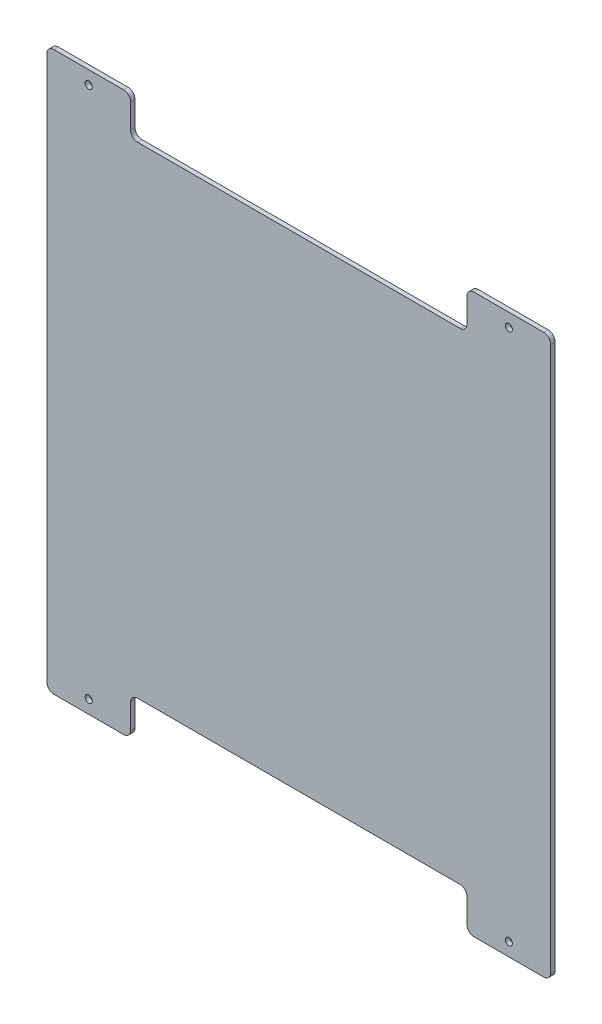
ISO-10303-21;
HEADER;
FILE_DESCRIPTION(('STEP AP214'),'2;1');
FILE_NAME('part.step','',(''),(''),'','','');
FILE_SCHEMA(('AUTOMOTIVE_DESIGN { 1 0 10303 214 1 1 1 1 }'));
ENDSEC;
DATA;
#1=APPLICATION_CONTEXT('core data for automotive mechanical design processes');
#2=APPLICATION_PROTOCOL_DEFINITION('international standard','automotive_design',2000,#1);
#3=PRODUCT_CONTEXT('',#1,'mechanical');
#4=PRODUCT('Part','Part','',(#3));
#5=PRODUCT_RELATED_PRODUCT_CATEGORY('part','',(#4));
#6=PRODUCT_DEFINITION_FORMATION('','',#4);
#7=PRODUCT_DEFINITION_CONTEXT('part definition',#1,'design');
#8=PRODUCT_DEFINITION('design','',#6,#7);
#9=PRODUCT_DEFINITION_SHAPE('','',#8);
#10=(LENGTH_UNIT() NAMED_UNIT(*) SI_UNIT(.MILLI.,.METRE.));
#11=(NAMED_UNIT(*) PLANE_ANGLE_UNIT() SI_UNIT($,.RADIAN.));
#12=(NAMED_UNIT(*) SI_UNIT($,.STERADIAN.) SOLID_ANGLE_UNIT());
#13=UNCERTAINTY_MEASURE_WITH_UNIT(LENGTH_MEASURE(1.E-05),#10,'distance_accuracy_value','');
#14=(GEOMETRIC_REPRESENTATION_CONTEXT(3) GLOBAL_UNCERTAINTY_ASSIGNED_CONTEXT((#13)) GLOBAL_UNIT_ASSIGNED_CONTEXT((#10,
#11,#12)) REPRESENTATION_CONTEXT('',''));
#15=CARTESIAN_POINT('',(0.,0.,0.));
#16=DIRECTION('',(0.,0.,1.));
#17=DIRECTION('',(1.,0.,0.));
#18=AXIS2_PLACEMENT_3D('',#15,#16,#17);
#19=CARTESIAN_POINT('',(115.500000041591,-177.5,3.175));
#20=DIRECTION('',(0.,0.,-1.));
#21=DIRECTION('',(-1.,0.,0.));
#22=AXIS2_PLACEMENT_3D('',#19,#20,#21);
#23=CYLINDRICAL_SURFACE('',#22,5.00000000000037);
#24=CARTESIAN_POINT('',(115.500000041591,-177.5,0.));
#25=DIRECTION('',(0.,0.,1.));
#26=DIRECTION('',(1.,0.,0.));
#27=AXIS2_PLACEMENT_3D('',#24,#25,#26);
#28=CIRCLE('',#27,5.00000000000037);
#29=CARTESIAN_POINT('',(120.500000041592,-177.5,0.));
#30=VERTEX_POINT('',#29);
#31=CARTESIAN_POINT('',(115.500000041591,-172.5,0.));
#32=VERTEX_POINT('',#31);
#33=EDGE_CURVE('E226',#30,#32,#28,.T.);
#34=ORIENTED_EDGE('',*,*,#33,.F.);
#35=DIRECTION('',(0.,0.,-1.));
#36=VECTOR('',#35,1.);
#37=CARTESIAN_POINT('',(120.500000041592,-177.5,3.175));
#38=LINE('',#37,#36);
#39=CARTESIAN_POINT('',(120.500000041592,-177.5,3.175));
#40=VERTEX_POINT('',#39);
#41=EDGE_CURVE('E11',#40,#30,#38,.T.);
#42=ORIENTED_EDGE('',*,*,#41,.F.);
#43=CARTESIAN_POINT('',(115.500000041591,-177.5,3.175));
#44=DIRECTION('',(0.,0.,1.));
#45=DIRECTION('',(1.,0.,0.));
#46=AXIS2_PLACEMENT_3D('',#43,#44,#45);
#47=CIRCLE('',#46,5.00000000000037);
#48=CARTESIAN_POINT('',(115.500000041591,-172.5,3.175));
#49=VERTEX_POINT('',#48);
#50=EDGE_CURVE('E290',#40,#49,#47,.T.);
#51=ORIENTED_EDGE('',*,*,#50,.T.);
#52=DIRECTION('',(0.,0.,-1.));
#53=VECTOR('',#52,1.);
#54=CARTESIAN_POINT('',(115.500000041591,-172.5,3.175));
#55=LINE('',#54,#53);
#56=EDGE_CURVE('E135',#49,#32,#55,.T.);
#57=ORIENTED_EDGE('',*,*,#56,.T.);
#58=EDGE_LOOP('',(#34,#42,#51,#57));
#59=FACE_BOUND('',#58,.T.);
#60=ADVANCED_FACE('F37',(#59),#23,.F.);
#61=CARTESIAN_POINT('',(120.500000041592,0.,3.175));
#62=DIRECTION('',(1.,0.,0.));
#63=DIRECTION('',(0.,1.,0.));
#64=AXIS2_PLACEMENT_3D('',#61,#62,#63);
#65=PLANE('',#64);
#66=DIRECTION('',(0.,-1.,0.));
#67=VECTOR('',#66,1.);
#68=CARTESIAN_POINT('',(120.500000041592,0.,0.));
#69=LINE('',#68,#67);
#70=CARTESIAN_POINT('',(120.500000041592,-195.,0.));
#71=VERTEX_POINT('',#70);
#72=EDGE_CURVE('E229',#30,#71,#69,.T.);
#73=ORIENTED_EDGE('',*,*,#72,.T.);
#74=DIRECTION('',(0.,0.,-1.));
#75=VECTOR('',#74,1.);
#76=CARTESIAN_POINT('',(120.500000041592,-195.,3.175));
#77=LINE('',#76,#75);
#78=CARTESIAN_POINT('',(120.500000041592,-195.,3.175));
#79=VERTEX_POINT('',#78);
#80=EDGE_CURVE('E45',#79,#71,#77,.T.);
#81=ORIENTED_EDGE('',*,*,#80,.F.);
#82=DIRECTION('',(0.,-1.,0.));
#83=VECTOR('',#82,1.);
#84=CARTESIAN_POINT('',(120.500000041592,0.,3.175));
#85=LINE('',#84,#83);
#86=EDGE_CURVE('E357',#40,#79,#85,.T.);
#87=ORIENTED_EDGE('',*,*,#86,.F.);
#88=ORIENTED_EDGE('',*,*,#41,.T.);
#89=EDGE_LOOP('',(#73,#81,#87,#88));
#90=FACE_BOUND('',#89,.T.);
#91=ADVANCED_FACE('F462',(#90),#65,.F.);
#92=CARTESIAN_POINT('',(125.500000041592,-195.,3.175));
#93=DIRECTION('',(0.,0.,-1.));
#94=DIRECTION('',(-1.,0.,0.));
#95=AXIS2_PLACEMENT_3D('',#92,#93,#94);
#96=CYLINDRICAL_SURFACE('',#95,5.00000000000001);
#97=CARTESIAN_POINT('',(125.500000041592,-195.,0.));
#98=DIRECTION('',(0.,0.,1.));
#99=DIRECTION('',(1.,0.,0.));
#100=AXIS2_PLACEMENT_3D('',#97,#98,#99);
#101=CIRCLE('',#100,5.00000000000001);
#102=CARTESIAN_POINT('',(125.500000041592,-200.,0.));
#103=VERTEX_POINT('',#102);
#104=EDGE_CURVE('E232',#71,#103,#101,.T.);
#105=ORIENTED_EDGE('',*,*,#104,.T.);
#106=DIRECTION('',(0.,0.,-1.));
#107=VECTOR('',#106,1.);
#108=CARTESIAN_POINT('',(125.500000041592,-200.,3.175));
#109=LINE('',#108,#107);
#110=CARTESIAN_POINT('',(125.500000041592,-200.,3.175));
#111=VERTEX_POINT('',#110);
#112=EDGE_CURVE('E332',#111,#103,#109,.T.);
#113=ORIENTED_EDGE('',*,*,#112,.F.);
#114=CARTESIAN_POINT('',(125.500000041592,-195.,3.175));
#115=DIRECTION('',(0.,0.,1.));
#116=DIRECTION('',(1.,0.,0.));
#117=AXIS2_PLACEMENT_3D('',#114,#115,#116);
#118=CIRCLE('',#117,5.00000000000001);
#119=EDGE_CURVE('E340',#79,#111,#118,.T.);
#120=ORIENTED_EDGE('',*,*,#119,.F.);
#121=ORIENTED_EDGE('',*,*,#80,.T.);
#122=EDGE_LOOP('',(#105,#113,#120,#121));
#123=FACE_BOUND('',#122,.T.);
#124=ADVANCED_FACE('F338',(#123),#96,.T.);
#125=CARTESIAN_POINT('',(1.11022302462516E-13,-200.,3.175));
#126=DIRECTION('',(0.,-1.,0.));
#127=DIRECTION('',(1.,0.,0.));
#128=AXIS2_PLACEMENT_3D('',#125,#126,#127);
#129=PLANE('',#128);
#130=DIRECTION('',(-1.,0.,0.));
#131=VECTOR('',#130,1.);
#132=CARTESIAN_POINT('',(1.11022302462516E-13,-200.,0.));
#133=LINE('',#132,#131);
#134=CARTESIAN_POINT('',(175.500000041592,-200.,0.));
#135=VERTEX_POINT('',#134);
#136=EDGE_CURVE('E235',#135,#103,#133,.T.);
#137=ORIENTED_EDGE('',*,*,#136,.F.);
#138=DIRECTION('',(0.,0.,-1.));
#139=VECTOR('',#138,1.);
#140=CARTESIAN_POINT('',(175.500000041592,-200.,3.175));
#141=LINE('',#140,#139);
#142=CARTESIAN_POINT('',(175.500000041592,-200.,3.175));
#143=VERTEX_POINT('',#142);
#144=EDGE_CURVE('E330',#143,#135,#141,.T.);
#145=ORIENTED_EDGE('',*,*,#144,.F.);
#146=DIRECTION('',(-1.,0.,0.));
#147=VECTOR('',#146,1.);
#148=CARTESIAN_POINT('',(1.11022302462516E-13,-200.,3.175));
#149=LINE('',#148,#147);
#150=EDGE_CURVE('E352',#143,#111,#149,.T.);
#151=ORIENTED_EDGE('',*,*,#150,.T.);
#152=ORIENTED_EDGE('',*,*,#112,.T.);
#153=EDGE_LOOP('',(#137,#145,#151,#152));
#154=FACE_BOUND('',#153,.T.);
#155=ADVANCED_FACE('F348',(#154),#129,.T.);
#156=CARTESIAN_POINT('',(175.500000041592,-195.,3.175));
#157=DIRECTION('',(0.,0.,-1.));
#158=DIRECTION('',(-1.,0.,0.));
#159=AXIS2_PLACEMENT_3D('',#156,#157,#158);
#160=CYLINDRICAL_SURFACE('',#159,5.00000000000002);
#161=CARTESIAN_POINT('',(175.500000041592,-195.,0.));
#162=DIRECTION('',(0.,0.,1.));
#163=DIRECTION('',(1.,0.,0.));
#164=AXIS2_PLACEMENT_3D('',#161,#162,#163);
#165=CIRCLE('',#164,5.00000000000002);
#166=CARTESIAN_POINT('',(180.500000041592,-195.,0.));
#167=VERTEX_POINT('',#166);
#168=EDGE_CURVE('E238',#135,#167,#165,.T.);
#169=ORIENTED_EDGE('',*,*,#168,.T.);
#170=DIRECTION('',(0.,0.,-1.));
#171=VECTOR('',#170,1.);
#172=CARTESIAN_POINT('',(180.500000041592,-195.,3.175));
#173=LINE('',#172,#171);
#174=CARTESIAN_POINT('',(180.500000041592,-195.,3.175));
#175=VERTEX_POINT('',#174);
#176=EDGE_CURVE('E328',#175,#167,#173,.T.);
#177=ORIENTED_EDGE('',*,*,#176,.F.);
#178=CARTESIAN_POINT('',(175.500000041592,-195.,3.175));
#179=DIRECTION('',(0.,0.,1.));
#180=DIRECTION('',(1.,0.,0.));
#181=AXIS2_PLACEMENT_3D('',#178,#179,#180);
#182=CIRCLE('',#181,5.00000000000002);
#183=EDGE_CURVE('E353',#143,#175,#182,.T.);
#184=ORIENTED_EDGE('',*,*,#183,.F.);
#185=ORIENTED_EDGE('',*,*,#144,.T.);
#186=EDGE_LOOP('',(#169,#177,#184,#185));
#187=FACE_BOUND('',#186,.T.);
#188=ADVANCED_FACE('F473',(#187),#160,.T.);
#189=CARTESIAN_POINT('',(180.500000041592,0.,3.175));
#190=DIRECTION('',(1.,0.,0.));
#191=DIRECTION('',(0.,0.,-1.));
#192=AXIS2_PLACEMENT_3D('',#189,#190,#191);
#193=PLANE('',#192);
#194=DIRECTION('',(0.,-1.,0.));
#195=VECTOR('',#194,1.);
#196=CARTESIAN_POINT('',(180.500000041592,0.,0.));
#197=LINE('',#196,#195);
#198=CARTESIAN_POINT('',(180.500000041592,195.,0.));
#199=VERTEX_POINT('',#198);
#200=EDGE_CURVE('E241',#199,#167,#197,.T.);
#201=ORIENTED_EDGE('',*,*,#200,.F.);
#202=DIRECTION('',(0.,0.,-1.));
#203=VECTOR('',#202,1.);
#204=CARTESIAN_POINT('',(180.500000041592,195.,3.175));
#205=LINE('',#204,#203);
#206=CARTESIAN_POINT('',(180.500000041592,195.,3.175));
#207=VERTEX_POINT('',#206);
#208=EDGE_CURVE('E326',#207,#199,#205,.T.);
#209=ORIENTED_EDGE('',*,*,#208,.F.);
#210=DIRECTION('',(0.,-1.,0.));
#211=VECTOR('',#210,1.);
#212=CARTESIAN_POINT('',(180.500000041592,0.,3.175));
#213=LINE('',#212,#211);
#214=EDGE_CURVE('E355',#207,#175,#213,.T.);
#215=ORIENTED_EDGE('',*,*,#214,.T.);
#216=ORIENTED_EDGE('',*,*,#176,.T.);
#217=EDGE_LOOP('',(#201,#209,#215,#216));
#218=FACE_BOUND('',#217,.T.);
#219=ADVANCED_FACE('F476',(#218),#193,.T.);
#220=CARTESIAN_POINT('',(175.500000041592,195.,3.175));
#221=DIRECTION('',(0.,0.,-1.));
#222=DIRECTION('',(-1.,0.,0.));
#223=AXIS2_PLACEMENT_3D('',#220,#221,#222);
#224=CYLINDRICAL_SURFACE('',#223,5.00000000000006);
#225=CARTESIAN_POINT('',(175.500000041592,195.,0.));
#226=DIRECTION('',(0.,0.,1.));
#227=DIRECTION('',(1.,0.,0.));
#228=AXIS2_PLACEMENT_3D('',#225,#226,#227);
#229=CIRCLE('',#228,5.00000000000006);
#230=CARTESIAN_POINT('',(175.500000041592,200.,0.));
#231=VERTEX_POINT('',#230);
#232=EDGE_CURVE('E244',#199,#231,#229,.T.);
#233=ORIENTED_EDGE('',*,*,#232,.T.);
#234=DIRECTION('',(0.,0.,-1.));
#235=VECTOR('',#234,1.);
#236=CARTESIAN_POINT('',(175.500000041592,200.,3.175));
#237=LINE('',#236,#235);
#238=CARTESIAN_POINT('',(175.500000041592,200.,3.175));
#239=VERTEX_POINT('',#238);
#240=EDGE_CURVE('E323',#239,#231,#237,.T.);
#241=ORIENTED_EDGE('',*,*,#240,.F.);
#242=CARTESIAN_POINT('',(175.500000041592,195.,3.175));
#243=DIRECTION('',(0.,0.,1.));
#244=DIRECTION('',(1.,0.,0.));
#245=AXIS2_PLACEMENT_3D('',#242,#243,#244);
#246=CIRCLE('',#245,5.00000000000006);
#247=EDGE_CURVE('E363',#207,#239,#246,.T.);
#248=ORIENTED_EDGE('',*,*,#247,.F.);
#249=ORIENTED_EDGE('',*,*,#208,.T.);
#250=EDGE_LOOP('',(#233,#241,#248,#249));
#251=FACE_BOUND('',#250,.T.);
#252=ADVANCED_FACE('F480',(#251),#224,.T.);
#253=CARTESIAN_POINT('',(-1.11022302462516E-13,200.,3.175));
#254=DIRECTION('',(0.,-1.,0.));
#255=DIRECTION('',(1.,0.,0.));
#256=AXIS2_PLACEMENT_3D('',#253,#254,#255);
#257=PLANE('',#256);
#258=DIRECTION('',(-1.,0.,0.));
#259=VECTOR('',#258,1.);
#260=CARTESIAN_POINT('',(-1.11022302462516E-13,200.,0.));
#261=LINE('',#260,#259);
#262=CARTESIAN_POINT('',(125.500000041592,200.,0.));
#263=VERTEX_POINT('',#262);
#264=EDGE_CURVE('E246',#231,#263,#261,.T.);
#265=ORIENTED_EDGE('',*,*,#264,.T.);
#266=DIRECTION('',(0.,0.,-1.));
#267=VECTOR('',#266,1.);
#268=CARTESIAN_POINT('',(125.500000041592,200.,3.175));
#269=LINE('',#268,#267);
#270=CARTESIAN_POINT('',(125.500000041592,200.,3.175));
#271=VERTEX_POINT('',#270);
#272=EDGE_CURVE('E321',#271,#263,#269,.T.);
#273=ORIENTED_EDGE('',*,*,#272,.F.);
#274=DIRECTION('',(-1.,0.,0.));
#275=VECTOR('',#274,1.);
#276=CARTESIAN_POINT('',(-1.11022302462516E-13,200.,3.175));
#277=LINE('',#276,#275);
#278=EDGE_CURVE('E365',#239,#271,#277,.T.);
#279=ORIENTED_EDGE('',*,*,#278,.F.);
#280=ORIENTED_EDGE('',*,*,#240,.T.);
#281=EDGE_LOOP('',(#265,#273,#279,#280));
#282=FACE_BOUND('',#281,.T.);
#283=ADVANCED_FACE('F484',(#282),#257,.F.);
#284=CARTESIAN_POINT('',(125.500000041592,195.,3.175));
#285=DIRECTION('',(0.,0.,-1.));
#286=DIRECTION('',(-1.,0.,0.));
#287=AXIS2_PLACEMENT_3D('',#284,#285,#286);
#288=CYLINDRICAL_SURFACE('',#287,5.);
#289=CARTESIAN_POINT('',(125.500000041592,195.,0.));
#290=DIRECTION('',(0.,0.,1.));
#291=DIRECTION('',(1.,0.,0.));
#292=AXIS2_PLACEMENT_3D('',#289,#290,#291);
#293=CIRCLE('',#292,5.);
#294=CARTESIAN_POINT('',(120.500000041592,195.,0.));
#295=VERTEX_POINT('',#294);
#296=EDGE_CURVE('E249',#295,#263,#293,.F.);
#297=ORIENTED_EDGE('',*,*,#296,.F.);
#298=DIRECTION('',(0.,0.,-1.));
#299=VECTOR('',#298,1.);
#300=CARTESIAN_POINT('',(120.500000041592,195.,3.175));
#301=LINE('',#300,#299);
#302=CARTESIAN_POINT('',(120.500000041592,195.,3.175));
#303=VERTEX_POINT('',#302);
#304=EDGE_CURVE('E319',#303,#295,#301,.T.);
#305=ORIENTED_EDGE('',*,*,#304,.F.);
#306=CARTESIAN_POINT('',(125.500000041592,195.,3.175));
#307=DIRECTION('',(0.,0.,1.));
#308=DIRECTION('',(1.,0.,0.));
#309=AXIS2_PLACEMENT_3D('',#306,#307,#308);
#310=CIRCLE('',#309,5.);
#311=EDGE_CURVE('E367',#303,#271,#310,.F.);
#312=ORIENTED_EDGE('',*,*,#311,.T.);
#313=ORIENTED_EDGE('',*,*,#272,.T.);
#314=EDGE_LOOP('',(#297,#305,#312,#313));
#315=FACE_BOUND('',#314,.T.);
#316=ADVANCED_FACE('F488',(#315),#288,.T.);
#317=CARTESIAN_POINT('',(120.500000041591,-2.86675445386084E-13,3.175));
#318=DIRECTION('',(-1.,0.,0.));
#319=DIRECTION('',(0.,-1.,0.));
#320=AXIS2_PLACEMENT_3D('',#317,#318,#319);
#321=PLANE('',#320);
#322=DIRECTION('',(0.,1.,0.));
#323=VECTOR('',#322,1.);
#324=CARTESIAN_POINT('',(120.500000041591,-2.86675445386084E-13,0.));
#325=LINE('',#324,#323);
#326=CARTESIAN_POINT('',(120.500000041592,177.5,0.));
#327=VERTEX_POINT('',#326);
#328=EDGE_CURVE('E252',#327,#295,#325,.T.);
#329=ORIENTED_EDGE('',*,*,#328,.F.);
#330=DIRECTION('',(0.,0.,-1.));
#331=VECTOR('',#330,1.);
#332=CARTESIAN_POINT('',(120.500000041592,177.5,3.175));
#333=LINE('',#332,#331);
#334=CARTESIAN_POINT('',(120.500000041592,177.5,3.175));
#335=VERTEX_POINT('',#334);
#336=EDGE_CURVE('E317',#335,#327,#333,.T.);
#337=ORIENTED_EDGE('',*,*,#336,.F.);
#338=DIRECTION('',(0.,1.,0.));
#339=VECTOR('',#338,1.);
#340=CARTESIAN_POINT('',(120.500000041591,-2.86675445386084E-13,3.175));
#341=LINE('',#340,#339);
#342=EDGE_CURVE('E370',#335,#303,#341,.T.);
#343=ORIENTED_EDGE('',*,*,#342,.T.);
#344=ORIENTED_EDGE('',*,*,#304,.T.);
#345=EDGE_LOOP('',(#329,#337,#343,#344));
#346=FACE_BOUND('',#345,.T.);
#347=ADVANCED_FACE('F492',(#346),#321,.T.);
#348=CARTESIAN_POINT('',(115.500000041592,177.5,3.175));
#349=DIRECTION('',(0.,0.,-1.));
#350=DIRECTION('',(-1.,0.,0.));
#351=AXIS2_PLACEMENT_3D('',#348,#349,#350);
#352=CYLINDRICAL_SURFACE('',#351,5.00000000000002);
#353=CARTESIAN_POINT('',(115.500000041592,177.5,0.));
#354=DIRECTION('',(0.,0.,1.));
#355=DIRECTION('',(1.,0.,0.));
#356=AXIS2_PLACEMENT_3D('',#353,#354,#355);
#357=CIRCLE('',#356,5.00000000000002);
#358=CARTESIAN_POINT('',(115.500000041592,172.5,0.));
#359=VERTEX_POINT('',#358);
#360=EDGE_CURVE('E255',#327,#359,#357,.F.);
#361=ORIENTED_EDGE('',*,*,#360,.T.);
#362=DIRECTION('',(0.,0.,-1.));
#363=VECTOR('',#362,1.);
#364=CARTESIAN_POINT('',(115.500000041592,172.5,3.175));
#365=LINE('',#364,#363);
#366=CARTESIAN_POINT('',(115.500000041592,172.5,3.175));
#367=VERTEX_POINT('',#366);
#368=EDGE_CURVE('E315',#367,#359,#365,.T.);
#369=ORIENTED_EDGE('',*,*,#368,.F.);
#370=CARTESIAN_POINT('',(115.500000041592,177.5,3.175));
#371=DIRECTION('',(0.,0.,1.));
#372=DIRECTION('',(1.,0.,0.));
#373=AXIS2_PLACEMENT_3D('',#370,#371,#372);
#374=CIRCLE('',#373,5.00000000000002);
#375=EDGE_CURVE('E373',#335,#367,#374,.F.);
#376=ORIENTED_EDGE('',*,*,#375,.F.);
#377=ORIENTED_EDGE('',*,*,#336,.T.);
#378=EDGE_LOOP('',(#361,#369,#376,#377));
#379=FACE_BOUND('',#378,.T.);
#380=ADVANCED_FACE('F496',(#379),#352,.F.);
#381=CARTESIAN_POINT('',(0.,172.5,3.175));
#382=DIRECTION('',(0.,1.,0.));
#383=DIRECTION('',(-1.,0.,0.));
#384=AXIS2_PLACEMENT_3D('',#381,#382,#383);
#385=PLANE('',#384);
#386=DIRECTION('',(1.,0.,0.));
#387=VECTOR('',#386,1.);
#388=CARTESIAN_POINT('',(0.,172.5,0.));
#389=LINE('',#388,#387);
#390=CARTESIAN_POINT('',(-115.500000041592,172.5,0.));
#391=VERTEX_POINT('',#390);
#392=EDGE_CURVE('E258',#391,#359,#389,.T.);
#393=ORIENTED_EDGE('',*,*,#392,.F.);
#394=DIRECTION('',(0.,0.,-1.));
#395=VECTOR('',#394,1.);
#396=CARTESIAN_POINT('',(-115.500000041592,172.5,3.175));
#397=LINE('',#396,#395);
#398=CARTESIAN_POINT('',(-115.500000041592,172.5,3.175));
#399=VERTEX_POINT('',#398);
#400=EDGE_CURVE('E313',#399,#391,#397,.T.);
#401=ORIENTED_EDGE('',*,*,#400,.F.);
#402=DIRECTION('',(1.,0.,0.));
#403=VECTOR('',#402,1.);
#404=CARTESIAN_POINT('',(0.,172.5,3.175));
#405=LINE('',#404,#403);
#406=EDGE_CURVE('E375',#399,#367,#405,.T.);
#407=ORIENTED_EDGE('',*,*,#406,.T.);
#408=ORIENTED_EDGE('',*,*,#368,.T.);
#409=EDGE_LOOP('',(#393,#401,#407,#408));
#410=FACE_BOUND('',#409,.T.);
#411=ADVANCED_FACE('F500',(#410),#385,.T.);
#412=CARTESIAN_POINT('',(-115.500000041592,177.5,3.175));
#413=DIRECTION('',(0.,0.,-1.));
#414=DIRECTION('',(-1.,0.,0.));
#415=AXIS2_PLACEMENT_3D('',#412,#413,#414);
#416=CYLINDRICAL_SURFACE('',#415,5.00000000000005);
#417=CARTESIAN_POINT('',(-115.500000041592,177.5,0.));
#418=DIRECTION('',(0.,0.,1.));
#419=DIRECTION('',(1.,0.,0.));
#420=AXIS2_PLACEMENT_3D('',#417,#418,#419);
#421=CIRCLE('',#420,5.00000000000005);
#422=CARTESIAN_POINT('',(-120.500000041592,177.5,0.));
#423=VERTEX_POINT('',#422);
#424=EDGE_CURVE('E261',#423,#391,#421,.T.);
#425=ORIENTED_EDGE('',*,*,#424,.F.);
#426=DIRECTION('',(0.,0.,-1.));
#427=VECTOR('',#426,1.);
#428=CARTESIAN_POINT('',(-120.500000041592,177.5,3.175));
#429=LINE('',#428,#427);
#430=CARTESIAN_POINT('',(-120.500000041592,177.5,3.175));
#431=VERTEX_POINT('',#430);
#432=EDGE_CURVE('E311',#431,#423,#429,.T.);
#433=ORIENTED_EDGE('',*,*,#432,.F.);
#434=CARTESIAN_POINT('',(-115.500000041592,177.5,3.175));
#435=DIRECTION('',(0.,0.,1.));
#436=DIRECTION('',(1.,0.,0.));
#437=AXIS2_PLACEMENT_3D('',#434,#435,#436);
#438=CIRCLE('',#437,5.00000000000005);
#439=EDGE_CURVE('E378',#431,#399,#438,.T.);
#440=ORIENTED_EDGE('',*,*,#439,.T.);
#441=ORIENTED_EDGE('',*,*,#400,.T.);
#442=EDGE_LOOP('',(#425,#433,#440,#441));
#443=FACE_BOUND('',#442,.T.);
#444=ADVANCED_FACE('F504',(#443),#416,.F.);
#445=CARTESIAN_POINT('',(-120.500000041592,0.,3.175));
#446=DIRECTION('',(-1.,0.,0.));
#447=DIRECTION('',(0.,-1.,0.));
#448=AXIS2_PLACEMENT_3D('',#445,#446,#447);
#449=PLANE('',#448);
#450=DIRECTION('',(0.,1.,0.));
#451=VECTOR('',#450,1.);
#452=CARTESIAN_POINT('',(-120.500000041592,0.,0.));
#453=LINE('',#452,#451);
#454=CARTESIAN_POINT('',(-120.500000041592,195.,0.));
#455=VERTEX_POINT('',#454);
#456=EDGE_CURVE('E264',#423,#455,#453,.T.);
#457=ORIENTED_EDGE('',*,*,#456,.T.);
#458=DIRECTION('',(0.,0.,-1.));
#459=VECTOR('',#458,1.);
#460=CARTESIAN_POINT('',(-120.500000041592,195.,3.175));
#461=LINE('',#460,#459);
#462=CARTESIAN_POINT('',(-120.500000041592,195.,3.175));
#463=VERTEX_POINT('',#462);
#464=EDGE_CURVE('E308',#463,#455,#461,.T.);
#465=ORIENTED_EDGE('',*,*,#464,.F.);
#466=DIRECTION('',(0.,1.,0.));
#467=VECTOR('',#466,1.);
#468=CARTESIAN_POINT('',(-120.500000041592,0.,3.175));
#469=LINE('',#468,#467);
#470=EDGE_CURVE('E381',#431,#463,#469,.T.);
#471=ORIENTED_EDGE('',*,*,#470,.F.);
#472=ORIENTED_EDGE('',*,*,#432,.T.);
#473=EDGE_LOOP('',(#457,#465,#471,#472));
#474=FACE_BOUND('',#473,.T.);
#475=ADVANCED_FACE('F508',(#474),#449,.F.);
#476=CARTESIAN_POINT('',(-125.500000041592,195.,3.175));
#477=DIRECTION('',(0.,0.,-1.));
#478=DIRECTION('',(-1.,0.,0.));
#479=AXIS2_PLACEMENT_3D('',#476,#477,#478);
#480=CYLINDRICAL_SURFACE('',#479,4.99999999999999);
#481=CARTESIAN_POINT('',(-125.500000041592,195.,0.));
#482=DIRECTION('',(0.,0.,1.));
#483=DIRECTION('',(1.,0.,0.));
#484=AXIS2_PLACEMENT_3D('',#481,#482,#483);
#485=CIRCLE('',#484,4.99999999999999);
#486=CARTESIAN_POINT('',(-125.500000041592,200.,0.));
#487=VERTEX_POINT('',#486);
#488=EDGE_CURVE('E266',#455,#487,#485,.T.);
#489=ORIENTED_EDGE('',*,*,#488,.T.);
#490=DIRECTION('',(0.,0.,-1.));
#491=VECTOR('',#490,1.);
#492=CARTESIAN_POINT('',(-125.500000041592,200.,3.175));
#493=LINE('',#492,#491);
#494=CARTESIAN_POINT('',(-125.500000041592,200.,3.175));
#495=VERTEX_POINT('',#494);
#496=EDGE_CURVE('E306',#495,#487,#493,.T.);
#497=ORIENTED_EDGE('',*,*,#496,.F.);
#498=CARTESIAN_POINT('',(-125.500000041592,195.,3.175));
#499=DIRECTION('',(0.,0.,1.));
#500=DIRECTION('',(1.,0.,0.));
#501=AXIS2_PLACEMENT_3D('',#498,#499,#500);
#502=CIRCLE('',#501,4.99999999999999);
#503=EDGE_CURVE('E383',#463,#495,#502,.T.);
#504=ORIENTED_EDGE('',*,*,#503,.F.);
#505=ORIENTED_EDGE('',*,*,#464,.T.);
#506=EDGE_LOOP('',(#489,#497,#504,#505));
#507=FACE_BOUND('',#506,.T.);
#508=ADVANCED_FACE('F512',(#507),#480,.T.);
#509=CARTESIAN_POINT('',(0.,200.,3.175));
#510=DIRECTION('',(0.,1.,0.));
#511=DIRECTION('',(0.,0.,1.));
#512=AXIS2_PLACEMENT_3D('',#509,#510,#511);
#513=PLANE('',#512);
#514=DIRECTION('',(1.,0.,0.));
#515=VECTOR('',#514,1.);
#516=CARTESIAN_POINT('',(0.,200.,0.));
#517=LINE('',#516,#515);
#518=CARTESIAN_POINT('',(-175.500000041592,200.,0.));
#519=VERTEX_POINT('',#518);
#520=EDGE_CURVE('E269',#519,#487,#517,.T.);
#521=ORIENTED_EDGE('',*,*,#520,.F.);
#522=DIRECTION('',(0.,0.,-1.));
#523=VECTOR('',#522,1.);
#524=CARTESIAN_POINT('',(-175.500000041592,200.,3.175));
#525=LINE('',#524,#523);
#526=CARTESIAN_POINT('',(-175.500000041592,200.,3.175));
#527=VERTEX_POINT('',#526);
#528=EDGE_CURVE('E304',#527,#519,#525,.T.);
#529=ORIENTED_EDGE('',*,*,#528,.F.);
#530=DIRECTION('',(1.,0.,0.));
#531=VECTOR('',#530,1.);
#532=CARTESIAN_POINT('',(0.,200.,3.175));
#533=LINE('',#532,#531);
#534=EDGE_CURVE('E385',#527,#495,#533,.T.);
#535=ORIENTED_EDGE('',*,*,#534,.T.);
#536=ORIENTED_EDGE('',*,*,#496,.T.);
#537=EDGE_LOOP('',(#521,#529,#535,#536));
#538=FACE_BOUND('',#537,.T.);
#539=ADVANCED_FACE('F516',(#538),#513,.T.);
#540=CARTESIAN_POINT('',(-175.500000041592,195.,3.175));
#541=DIRECTION('',(0.,0.,-1.));
#542=DIRECTION('',(-1.,0.,0.));
#543=AXIS2_PLACEMENT_3D('',#540,#541,#542);
#544=CYLINDRICAL_SURFACE('',#543,4.99999999999999);
#545=CARTESIAN_POINT('',(-175.500000041592,195.,0.));
#546=DIRECTION('',(0.,0.,1.));
#547=DIRECTION('',(1.,0.,0.));
#548=AXIS2_PLACEMENT_3D('',#545,#546,#547);
#549=CIRCLE('',#548,4.99999999999999);
#550=CARTESIAN_POINT('',(-180.500000041592,195.,0.));
#551=VERTEX_POINT('',#550);
#552=EDGE_CURVE('E272',#519,#551,#549,.T.);
#553=ORIENTED_EDGE('',*,*,#552,.T.);
#554=DIRECTION('',(0.,0.,-1.));
#555=VECTOR('',#554,1.);
#556=CARTESIAN_POINT('',(-180.500000041592,195.,3.175));
#557=LINE('',#556,#555);
#558=CARTESIAN_POINT('',(-180.500000041592,195.,3.175));
#559=VERTEX_POINT('',#558);
#560=EDGE_CURVE('E302',#559,#551,#557,.T.);
#561=ORIENTED_EDGE('',*,*,#560,.F.);
#562=CARTESIAN_POINT('',(-175.500000041592,195.,3.175));
#563=DIRECTION('',(0.,0.,1.));
#564=DIRECTION('',(1.,0.,0.));
#565=AXIS2_PLACEMENT_3D('',#562,#563,#564);
#566=CIRCLE('',#565,4.99999999999999);
#567=EDGE_CURVE('E388',#527,#559,#566,.T.);
#568=ORIENTED_EDGE('',*,*,#567,.F.);
#569=ORIENTED_EDGE('',*,*,#528,.T.);
#570=EDGE_LOOP('',(#553,#561,#568,#569));
#571=FACE_BOUND('',#570,.T.);
#572=ADVANCED_FACE('F520',(#571),#544,.T.);
#573=CARTESIAN_POINT('',(-180.500000041592,0.,3.175));
#574=DIRECTION('',(-1.,0.,0.));
#575=DIRECTION('',(0.,0.,1.));
#576=AXIS2_PLACEMENT_3D('',#573,#574,#575);
#577=PLANE('',#576);
#578=DIRECTION('',(0.,1.,0.));
#579=VECTOR('',#578,1.);
#580=CARTESIAN_POINT('',(-180.500000041592,0.,0.));
#581=LINE('',#580,#579);
#582=CARTESIAN_POINT('',(-180.500000041592,-195.,0.));
#583=VERTEX_POINT('',#582);
#584=EDGE_CURVE('E275',#583,#551,#581,.T.);
#585=ORIENTED_EDGE('',*,*,#584,.F.);
#586=DIRECTION('',(0.,0.,-1.));
#587=VECTOR('',#586,1.);
#588=CARTESIAN_POINT('',(-180.500000041592,-195.,3.175));
#589=LINE('',#588,#587);
#590=CARTESIAN_POINT('',(-180.500000041592,-195.,3.175));
#591=VERTEX_POINT('',#590);
#592=EDGE_CURVE('E300',#591,#583,#589,.T.);
#593=ORIENTED_EDGE('',*,*,#592,.F.);
#594=DIRECTION('',(0.,1.,0.));
#595=VECTOR('',#594,1.);
#596=CARTESIAN_POINT('',(-180.500000041592,0.,3.175));
#597=LINE('',#596,#595);
#598=EDGE_CURVE('E390',#591,#559,#597,.T.);
#599=ORIENTED_EDGE('',*,*,#598,.T.);
#600=ORIENTED_EDGE('',*,*,#560,.T.);
#601=EDGE_LOOP('',(#585,#593,#599,#600));
#602=FACE_BOUND('',#601,.T.);
#603=ADVANCED_FACE('F524',(#602),#577,.T.);
#604=CARTESIAN_POINT('',(-175.500000041592,-195.,3.175));
#605=DIRECTION('',(0.,0.,-1.));
#606=DIRECTION('',(-1.,0.,0.));
#607=AXIS2_PLACEMENT_3D('',#604,#605,#606);
#608=CYLINDRICAL_SURFACE('',#607,4.99999999999987);
#609=CARTESIAN_POINT('',(-175.500000041592,-195.,0.));
#610=DIRECTION('',(0.,0.,1.));
#611=DIRECTION('',(1.,0.,0.));
#612=AXIS2_PLACEMENT_3D('',#609,#610,#611);
#613=CIRCLE('',#612,4.99999999999987);
#614=CARTESIAN_POINT('',(-175.500000041592,-200.,0.));
#615=VERTEX_POINT('',#614);
#616=EDGE_CURVE('E278',#583,#615,#613,.T.);
#617=ORIENTED_EDGE('',*,*,#616,.T.);
#618=DIRECTION('',(0.,0.,-1.));
#619=VECTOR('',#618,1.);
#620=CARTESIAN_POINT('',(-175.500000041592,-200.,3.175));
#621=LINE('',#620,#619);
#622=CARTESIAN_POINT('',(-175.500000041592,-200.,3.175));
#623=VERTEX_POINT('',#622);
#624=EDGE_CURVE('E297',#623,#615,#621,.T.);
#625=ORIENTED_EDGE('',*,*,#624,.F.);
#626=CARTESIAN_POINT('',(-175.500000041592,-195.,3.175));
#627=DIRECTION('',(0.,0.,1.));
#628=DIRECTION('',(1.,0.,0.));
#629=AXIS2_PLACEMENT_3D('',#626,#627,#628);
#630=CIRCLE('',#629,4.99999999999987);
#631=EDGE_CURVE('E393',#591,#623,#630,.T.);
#632=ORIENTED_EDGE('',*,*,#631,.F.);
#633=ORIENTED_EDGE('',*,*,#592,.T.);
#634=EDGE_LOOP('',(#617,#625,#632,#633));
#635=FACE_BOUND('',#634,.T.);
#636=ADVANCED_FACE('F528',(#635),#608,.T.);
#637=CARTESIAN_POINT('',(0.,-200.,3.175));
#638=DIRECTION('',(0.,1.,0.));
#639=DIRECTION('',(0.,0.,1.));
#640=AXIS2_PLACEMENT_3D('',#637,#638,#639);
#641=PLANE('',#640);
#642=DIRECTION('',(1.,0.,0.));
#643=VECTOR('',#642,1.);
#644=CARTESIAN_POINT('',(0.,-200.,0.));
#645=LINE('',#644,#643);
#646=CARTESIAN_POINT('',(-125.500000041591,-200.,0.));
#647=VERTEX_POINT('',#646);
#648=EDGE_CURVE('E280',#615,#647,#645,.T.);
#649=ORIENTED_EDGE('',*,*,#648,.T.);
#650=DIRECTION('',(0.,0.,-1.));
#651=VECTOR('',#650,1.);
#652=CARTESIAN_POINT('',(-125.500000041591,-200.,3.175));
#653=LINE('',#652,#651);
#654=CARTESIAN_POINT('',(-125.500000041591,-200.,3.175));
#655=VERTEX_POINT('',#654);
#656=EDGE_CURVE('E294',#655,#647,#653,.T.);
#657=ORIENTED_EDGE('',*,*,#656,.F.);
#658=DIRECTION('',(1.,0.,0.));
#659=VECTOR('',#658,1.);
#660=CARTESIAN_POINT('',(0.,-200.,3.175));
#661=LINE('',#660,#659);
#662=EDGE_CURVE('E395',#623,#655,#661,.T.);
#663=ORIENTED_EDGE('',*,*,#662,.F.);
#664=ORIENTED_EDGE('',*,*,#624,.T.);
#665=EDGE_LOOP('',(#649,#657,#663,#664));
#666=FACE_BOUND('',#665,.T.);
#667=ADVANCED_FACE('F402',(#666),#641,.F.);
#668=CARTESIAN_POINT('',(-125.500000041591,-195.000000000001,3.175));
#669=DIRECTION('',(0.,0.,-1.));
#670=DIRECTION('',(-1.,0.,0.));
#671=AXIS2_PLACEMENT_3D('',#668,#669,#670);
#672=CYLINDRICAL_SURFACE('',#671,4.99999999999926);
#673=CARTESIAN_POINT('',(-125.500000041591,-195.000000000001,0.));
#674=DIRECTION('',(0.,0.,1.));
#675=DIRECTION('',(1.,0.,0.));
#676=AXIS2_PLACEMENT_3D('',#673,#674,#675);
#677=CIRCLE('',#676,4.99999999999926);
#678=CARTESIAN_POINT('',(-120.500000041592,-195.000000000001,0.));
#679=VERTEX_POINT('',#678);
#680=EDGE_CURVE('E282',#647,#679,#677,.T.);
#681=ORIENTED_EDGE('',*,*,#680,.T.);
#682=DIRECTION('',(0.,0.,-1.));
#683=VECTOR('',#682,1.);
#684=CARTESIAN_POINT('',(-120.500000041592,-195.000000000001,3.175));
#685=LINE('',#684,#683);
#686=CARTESIAN_POINT('',(-120.500000041592,-195.000000000001,3.175));
#687=VERTEX_POINT('',#686);
#688=EDGE_CURVE('E213',#687,#679,#685,.T.);
#689=ORIENTED_EDGE('',*,*,#688,.F.);
#690=CARTESIAN_POINT('',(-125.500000041591,-195.000000000001,3.175));
#691=DIRECTION('',(0.,0.,1.));
#692=DIRECTION('',(1.,0.,0.));
#693=AXIS2_PLACEMENT_3D('',#690,#691,#692);
#694=CIRCLE('',#693,4.99999999999926);
#695=EDGE_CURVE('E218',#655,#687,#694,.T.);
#696=ORIENTED_EDGE('',*,*,#695,.F.);
#697=ORIENTED_EDGE('',*,*,#656,.T.);
#698=EDGE_LOOP('',(#681,#689,#696,#697));
#699=FACE_BOUND('',#698,.T.);
#700=ADVANCED_FACE('F406',(#699),#672,.T.);
#701=CARTESIAN_POINT('',(-120.500000041591,4.7779240897679E-13,3.175));
#702=DIRECTION('',(1.,0.,0.));
#703=DIRECTION('',(0.,1.,0.));
#704=AXIS2_PLACEMENT_3D('',#701,#702,#703);
#705=PLANE('',#704);
#706=DIRECTION('',(0.,-1.,0.));
#707=VECTOR('',#706,1.);
#708=CARTESIAN_POINT('',(-120.500000041591,4.7779240897679E-13,0.));
#709=LINE('',#708,#707);
#710=CARTESIAN_POINT('',(-120.500000041592,-177.5,0.));
#711=VERTEX_POINT('',#710);
#712=EDGE_CURVE('E208',#711,#679,#709,.T.);
#713=ORIENTED_EDGE('',*,*,#712,.F.);
#714=DIRECTION('',(0.,0.,-1.));
#715=VECTOR('',#714,1.);
#716=CARTESIAN_POINT('',(-120.500000041592,-177.5,3.175));
#717=LINE('',#716,#715);
#718=CARTESIAN_POINT('',(-120.500000041592,-177.5,3.175));
#719=VERTEX_POINT('',#718);
#720=EDGE_CURVE('E203',#719,#711,#717,.T.);
#721=ORIENTED_EDGE('',*,*,#720,.F.);
#722=DIRECTION('',(0.,-1.,0.));
#723=VECTOR('',#722,1.);
#724=CARTESIAN_POINT('',(-120.500000041591,4.7779240897679E-13,3.175));
#725=LINE('',#724,#723);
#726=EDGE_CURVE('E206',#719,#687,#725,.T.);
#727=ORIENTED_EDGE('',*,*,#726,.T.);
#728=ORIENTED_EDGE('',*,*,#688,.T.);
#729=EDGE_LOOP('',(#713,#721,#727,#728));
#730=FACE_BOUND('',#729,.T.);
#731=ADVANCED_FACE('F205',(#730),#705,.T.);
#732=CARTESIAN_POINT('',(-115.500000041592,-177.5,3.175));
#733=DIRECTION('',(0.,0.,-1.));
#734=DIRECTION('',(-1.,0.,0.));
#735=AXIS2_PLACEMENT_3D('',#732,#733,#734);
#736=CYLINDRICAL_SURFACE('',#735,5.0000000000001);
#737=CARTESIAN_POINT('',(-115.500000041592,-177.5,0.));
#738=DIRECTION('',(0.,0.,1.));
#739=DIRECTION('',(1.,0.,0.));
#740=AXIS2_PLACEMENT_3D('',#737,#738,#739);
#741=CIRCLE('',#740,5.0000000000001);
#742=CARTESIAN_POINT('',(-115.500000041592,-172.5,0.));
#743=VERTEX_POINT('',#742);
#744=EDGE_CURVE('E286',#743,#711,#741,.T.);
#745=ORIENTED_EDGE('',*,*,#744,.F.);
#746=DIRECTION('',(0.,0.,-1.));
#747=VECTOR('',#746,1.);
#748=CARTESIAN_POINT('',(-115.500000041592,-172.5,3.175));
#749=LINE('',#748,#747);
#750=CARTESIAN_POINT('',(-115.500000041592,-172.5,3.175));
#751=VERTEX_POINT('',#750);
#752=EDGE_CURVE('E128',#751,#743,#749,.T.);
#753=ORIENTED_EDGE('',*,*,#752,.F.);
#754=CARTESIAN_POINT('',(-115.500000041592,-177.5,3.175));
#755=DIRECTION('',(0.,0.,1.));
#756=DIRECTION('',(1.,0.,0.));
#757=AXIS2_PLACEMENT_3D('',#754,#755,#756);
#758=CIRCLE('',#757,5.0000000000001);
#759=EDGE_CURVE('E216',#751,#719,#758,.T.);
#760=ORIENTED_EDGE('',*,*,#759,.T.);
#761=ORIENTED_EDGE('',*,*,#720,.T.);
#762=EDGE_LOOP('',(#745,#753,#760,#761));
#763=FACE_BOUND('',#762,.T.);
#764=ADVANCED_FACE('F221',(#763),#736,.F.);
#765=CARTESIAN_POINT('',(0.,-172.5,3.175));
#766=DIRECTION('',(0.,1.,0.));
#767=DIRECTION('',(-1.,0.,0.));
#768=AXIS2_PLACEMENT_3D('',#765,#766,#767);
#769=PLANE('',#768);
#770=DIRECTION('',(1.,0.,0.));
#771=VECTOR('',#770,1.);
#772=CARTESIAN_POINT('',(0.,-172.5,0.));
#773=LINE('',#772,#771);
#774=EDGE_CURVE('E288',#743,#32,#773,.T.);
#775=ORIENTED_EDGE('',*,*,#774,.T.);
#776=ORIENTED_EDGE('',*,*,#56,.F.);
#777=DIRECTION('',(1.,0.,0.));
#778=VECTOR('',#777,1.);
#779=CARTESIAN_POINT('',(0.,-172.5,3.175));
#780=LINE('',#779,#778);
#781=EDGE_CURVE('E53',#751,#49,#780,.T.);
#782=ORIENTED_EDGE('',*,*,#781,.F.);
#783=ORIENTED_EDGE('',*,*,#752,.T.);
#784=EDGE_LOOP('',(#775,#776,#782,#783));
#785=FACE_BOUND('',#784,.T.);
#786=ADVANCED_FACE('F407',(#785),#769,.F.);
#787=CARTESIAN_POINT('',(0.,0.,3.175));
#788=DIRECTION('',(0.,0.,1.));
#789=DIRECTION('',(1.,0.,0.));
#790=AXIS2_PLACEMENT_3D('',#787,#788,#789);
#791=PLANE('',#790);
#792=CARTESIAN_POINT('',(150.499999999982,190.500000000004,3.175));
#793=DIRECTION('',(0.,0.,1.));
#794=DIRECTION('',(1.,0.,0.));
#795=AXIS2_PLACEMENT_3D('',#792,#793,#794);
#796=CIRCLE('',#795,2.54999999999999);
#797=CARTESIAN_POINT('',(153.049999999982,190.500000000004,3.175));
#798=VERTEX_POINT('',#797);
#799=EDGE_CURVE('E430',#798,#798,#796,.T.);
#800=ORIENTED_EDGE('',*,*,#799,.F.);
#801=EDGE_LOOP('',(#800));
#802=FACE_BOUND('',#801,.T.);
#803=CARTESIAN_POINT('',(150.499999999986,-190.499999999995,3.175));
#804=DIRECTION('',(0.,0.,1.));
#805=DIRECTION('',(1.,0.,0.));
#806=AXIS2_PLACEMENT_3D('',#803,#804,#805);
#807=CIRCLE('',#806,2.54999999999999);
#808=CARTESIAN_POINT('',(153.049999999986,-190.499999999995,3.175));
#809=VERTEX_POINT('',#808);
#810=EDGE_CURVE('E424',#809,#809,#807,.T.);
#811=ORIENTED_EDGE('',*,*,#810,.F.);
#812=EDGE_LOOP('',(#811));
#813=FACE_BOUND('',#812,.T.);
#814=CARTESIAN_POINT('',(-150.500000000014,-190.5,3.175));
#815=DIRECTION('',(0.,0.,1.));
#816=DIRECTION('',(1.,0.,0.));
#817=AXIS2_PLACEMENT_3D('',#814,#815,#816);
#818=CIRCLE('',#817,2.54999999999999);
#819=CARTESIAN_POINT('',(-147.950000000014,-190.5,3.175));
#820=VERTEX_POINT('',#819);
#821=EDGE_CURVE('E418',#820,#820,#818,.T.);
#822=ORIENTED_EDGE('',*,*,#821,.F.);
#823=EDGE_LOOP('',(#822));
#824=FACE_BOUND('',#823,.T.);
#825=CARTESIAN_POINT('',(-150.500000000018,190.5,3.175));
#826=DIRECTION('',(0.,0.,1.));
#827=DIRECTION('',(1.,0.,0.));
#828=AXIS2_PLACEMENT_3D('',#825,#826,#827);
#829=CIRCLE('',#828,2.54999999999999);
#830=CARTESIAN_POINT('',(-147.950000000018,190.5,3.175));
#831=VERTEX_POINT('',#830);
#832=EDGE_CURVE('E412',#831,#831,#829,.T.);
#833=ORIENTED_EDGE('',*,*,#832,.F.);
#834=EDGE_LOOP('',(#833));
#835=FACE_BOUND('',#834,.T.);
#836=ORIENTED_EDGE('',*,*,#50,.F.);
#837=ORIENTED_EDGE('',*,*,#86,.T.);
#838=ORIENTED_EDGE('',*,*,#119,.T.);
#839=ORIENTED_EDGE('',*,*,#150,.F.);
#840=ORIENTED_EDGE('',*,*,#183,.T.);
#841=ORIENTED_EDGE('',*,*,#214,.F.);
#842=ORIENTED_EDGE('',*,*,#247,.T.);
#843=ORIENTED_EDGE('',*,*,#278,.T.);
#844=ORIENTED_EDGE('',*,*,#311,.F.);
#845=ORIENTED_EDGE('',*,*,#342,.F.);
#846=ORIENTED_EDGE('',*,*,#375,.T.);
#847=ORIENTED_EDGE('',*,*,#406,.F.);
#848=ORIENTED_EDGE('',*,*,#439,.F.);
#849=ORIENTED_EDGE('',*,*,#470,.T.);
#850=ORIENTED_EDGE('',*,*,#503,.T.);
#851=ORIENTED_EDGE('',*,*,#534,.F.);
#852=ORIENTED_EDGE('',*,*,#567,.T.);
#853=ORIENTED_EDGE('',*,*,#598,.F.);
#854=ORIENTED_EDGE('',*,*,#631,.T.);
#855=ORIENTED_EDGE('',*,*,#662,.T.);
#856=ORIENTED_EDGE('',*,*,#695,.T.);
#857=ORIENTED_EDGE('',*,*,#726,.F.);
#858=ORIENTED_EDGE('',*,*,#759,.F.);
#859=ORIENTED_EDGE('',*,*,#781,.T.);
#860=EDGE_LOOP('',(#836,#837,#838,#839,#840,#841,#842,#843,#844,#845,#846,#847,#848,#849,#850,
#851,#852,#853,#854,#855,#856,#857,#858,#859));
#861=FACE_BOUND('',#860,.T.);
#862=ADVANCED_FACE('F215',(#802,#813,#824,#835,#861),#791,.T.);
#863=CARTESIAN_POINT('',(0.,0.,0.));
#864=DIRECTION('',(0.,0.,1.));
#865=DIRECTION('',(1.,0.,0.));
#866=AXIS2_PLACEMENT_3D('',#863,#864,#865);
#867=PLANE('',#866);
#868=CARTESIAN_POINT('',(150.499999999982,190.500000000004,0.));
#869=DIRECTION('',(0.,0.,1.));
#870=DIRECTION('',(1.,0.,0.));
#871=AXIS2_PLACEMENT_3D('',#868,#869,#870);
#872=CIRCLE('',#871,2.54999999999999);
#873=CARTESIAN_POINT('',(153.049999999982,190.500000000004,0.));
#874=VERTEX_POINT('',#873);
#875=EDGE_CURVE('E427',#874,#874,#872,.F.);
#876=ORIENTED_EDGE('',*,*,#875,.F.);
#877=EDGE_LOOP('',(#876));
#878=FACE_BOUND('',#877,.T.);
#879=CARTESIAN_POINT('',(150.499999999986,-190.499999999995,0.));
#880=DIRECTION('',(0.,0.,1.));
#881=DIRECTION('',(1.,0.,0.));
#882=AXIS2_PLACEMENT_3D('',#879,#880,#881);
#883=CIRCLE('',#882,2.54999999999999);
#884=CARTESIAN_POINT('',(153.049999999986,-190.499999999995,0.));
#885=VERTEX_POINT('',#884);
#886=EDGE_CURVE('E421',#885,#885,#883,.F.);
#887=ORIENTED_EDGE('',*,*,#886,.F.);
#888=EDGE_LOOP('',(#887));
#889=FACE_BOUND('',#888,.T.);
#890=CARTESIAN_POINT('',(-150.500000000014,-190.5,0.));
#891=DIRECTION('',(0.,0.,1.));
#892=DIRECTION('',(1.,0.,0.));
#893=AXIS2_PLACEMENT_3D('',#890,#891,#892);
#894=CIRCLE('',#893,2.54999999999999);
#895=CARTESIAN_POINT('',(-147.950000000014,-190.5,0.));
#896=VERTEX_POINT('',#895);
#897=EDGE_CURVE('E415',#896,#896,#894,.F.);
#898=ORIENTED_EDGE('',*,*,#897,.F.);
#899=EDGE_LOOP('',(#898));
#900=FACE_BOUND('',#899,.T.);
#901=CARTESIAN_POINT('',(-150.500000000018,190.5,0.));
#902=DIRECTION('',(0.,0.,1.));
#903=DIRECTION('',(1.,0.,0.));
#904=AXIS2_PLACEMENT_3D('',#901,#902,#903);
#905=CIRCLE('',#904,2.54999999999999);
#906=CARTESIAN_POINT('',(-147.950000000018,190.5,0.));
#907=VERTEX_POINT('',#906);
#908=EDGE_CURVE('E230',#907,#907,#905,.F.);
#909=ORIENTED_EDGE('',*,*,#908,.F.);
#910=EDGE_LOOP('',(#909));
#911=FACE_BOUND('',#910,.T.);
#912=ORIENTED_EDGE('',*,*,#33,.T.);
#913=ORIENTED_EDGE('',*,*,#774,.F.);
#914=ORIENTED_EDGE('',*,*,#744,.T.);
#915=ORIENTED_EDGE('',*,*,#712,.T.);
#916=ORIENTED_EDGE('',*,*,#680,.F.);
#917=ORIENTED_EDGE('',*,*,#648,.F.);
#918=ORIENTED_EDGE('',*,*,#616,.F.);
#919=ORIENTED_EDGE('',*,*,#584,.T.);
#920=ORIENTED_EDGE('',*,*,#552,.F.);
#921=ORIENTED_EDGE('',*,*,#520,.T.);
#922=ORIENTED_EDGE('',*,*,#488,.F.);
#923=ORIENTED_EDGE('',*,*,#456,.F.);
#924=ORIENTED_EDGE('',*,*,#424,.T.);
#925=ORIENTED_EDGE('',*,*,#392,.T.);
#926=ORIENTED_EDGE('',*,*,#360,.F.);
#927=ORIENTED_EDGE('',*,*,#328,.T.);
#928=ORIENTED_EDGE('',*,*,#296,.T.);
#929=ORIENTED_EDGE('',*,*,#264,.F.);
#930=ORIENTED_EDGE('',*,*,#232,.F.);
#931=ORIENTED_EDGE('',*,*,#200,.T.);
#932=ORIENTED_EDGE('',*,*,#168,.F.);
#933=ORIENTED_EDGE('',*,*,#136,.T.);
#934=ORIENTED_EDGE('',*,*,#104,.F.);
#935=ORIENTED_EDGE('',*,*,#72,.F.);
#936=EDGE_LOOP('',(#912,#913,#914,#915,#916,#917,#918,#919,#920,#921,#922,#923,#924,#925,#926,
#927,#928,#929,#930,#931,#932,#933,#934,#935));
#937=FACE_BOUND('',#936,.T.);
#938=ADVANCED_FACE('F344',(#878,#889,#900,#911,#937),#867,.F.);
#939=CARTESIAN_POINT('',(-150.500000000018,190.5,-0.00100000000000013));
#940=DIRECTION('',(0.,0.,1.));
#941=DIRECTION('',(1.,0.,0.));
#942=AXIS2_PLACEMENT_3D('',#939,#940,#941);
#943=CYLINDRICAL_SURFACE('',#942,2.54999999999999);
#944=ORIENTED_EDGE('',*,*,#832,.T.);
#945=EDGE_LOOP('',(#944));
#946=FACE_BOUND('',#945,.T.);
#947=ORIENTED_EDGE('',*,*,#908,.T.);
#948=EDGE_LOOP('',(#947));
#949=FACE_BOUND('',#948,.T.);
#950=ADVANCED_FACE('F446',(#946,#949),#943,.F.);
#951=CARTESIAN_POINT('',(-150.500000000014,-190.5,-0.00100000000000013));
#952=DIRECTION('',(0.,0.,1.));
#953=DIRECTION('',(1.,0.,0.));
#954=AXIS2_PLACEMENT_3D('',#951,#952,#953);
#955=CYLINDRICAL_SURFACE('',#954,2.54999999999999);
#956=ORIENTED_EDGE('',*,*,#821,.T.);
#957=EDGE_LOOP('',(#956));
#958=FACE_BOUND('',#957,.T.);
#959=ORIENTED_EDGE('',*,*,#897,.T.);
#960=EDGE_LOOP('',(#959));
#961=FACE_BOUND('',#960,.T.);
#962=ADVANCED_FACE('F449',(#958,#961),#955,.F.);
#963=CARTESIAN_POINT('',(150.499999999986,-190.499999999995,-0.00100000000000013));
#964=DIRECTION('',(0.,0.,1.));
#965=DIRECTION('',(1.,0.,0.));
#966=AXIS2_PLACEMENT_3D('',#963,#964,#965);
#967=CYLINDRICAL_SURFACE('',#966,2.54999999999999);
#968=ORIENTED_EDGE('',*,*,#810,.T.);
#969=EDGE_LOOP('',(#968));
#970=FACE_BOUND('',#969,.T.);
#971=ORIENTED_EDGE('',*,*,#886,.T.);
#972=EDGE_LOOP('',(#971));
#973=FACE_BOUND('',#972,.T.);
#974=ADVANCED_FACE('F568',(#970,#973),#967,.F.);
#975=CARTESIAN_POINT('',(150.499999999982,190.500000000004,-0.00100000000000013));
#976=DIRECTION('',(0.,0.,1.));
#977=DIRECTION('',(1.,0.,0.));
#978=AXIS2_PLACEMENT_3D('',#975,#976,#977);
#979=CYLINDRICAL_SURFACE('',#978,2.54999999999999);
#980=ORIENTED_EDGE('',*,*,#799,.T.);
#981=EDGE_LOOP('',(#980));
#982=FACE_BOUND('',#981,.T.);
#983=ORIENTED_EDGE('',*,*,#875,.T.);
#984=EDGE_LOOP('',(#983));
#985=FACE_BOUND('',#984,.T.);
#986=ADVANCED_FACE('F434',(#982,#985),#979,.F.);
#987=CLOSED_SHELL('',(#60,#91,#124,#155,#188,#219,#252,#283,#316,#347,#380,#411,#444,#475,#508,
#539,#572,#603,#636,#667,#700,#731,#764,#786,#862,#938,#950,#962,#974,#986));
#988=MANIFOLD_SOLID_BREP('B2',#987);
#989=ADVANCED_BREP_SHAPE_REPRESENTATION('',(#18,#988),#14);
#990=SHAPE_DEFINITION_REPRESENTATION(#9,#989);
ENDSEC;
END-ISO-10303-21;
